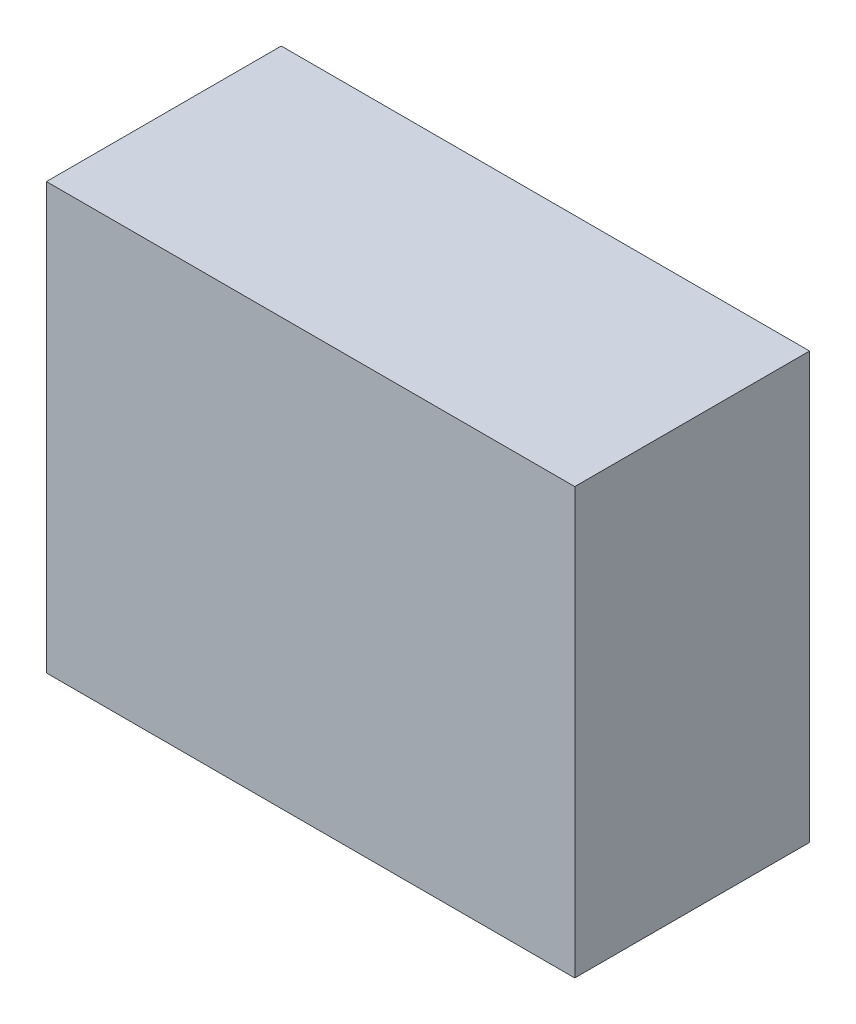
ISO-10303-21;
HEADER;
FILE_DESCRIPTION(('STEP AP214'),'2;1');
FILE_NAME('part.step','',(''),(''),'','','');
FILE_SCHEMA(('AUTOMOTIVE_DESIGN { 1 0 10303 214 1 1 1 1 }'));
ENDSEC;
DATA;
#1=APPLICATION_CONTEXT('core data for automotive mechanical design processes');
#2=APPLICATION_PROTOCOL_DEFINITION('international standard','automotive_design',2000,#1);
#3=PRODUCT_CONTEXT('',#1,'mechanical');
#4=PRODUCT('Part','Part','',(#3));
#5=PRODUCT_RELATED_PRODUCT_CATEGORY('part','',(#4));
#6=PRODUCT_DEFINITION_FORMATION('','',#4);
#7=PRODUCT_DEFINITION_CONTEXT('part definition',#1,'design');
#8=PRODUCT_DEFINITION('design','',#6,#7);
#9=PRODUCT_DEFINITION_SHAPE('','',#8);
#10=(LENGTH_UNIT() NAMED_UNIT(*) SI_UNIT(.MILLI.,.METRE.));
#11=(NAMED_UNIT(*) PLANE_ANGLE_UNIT() SI_UNIT($,.RADIAN.));
#12=(NAMED_UNIT(*) SI_UNIT($,.STERADIAN.) SOLID_ANGLE_UNIT());
#13=UNCERTAINTY_MEASURE_WITH_UNIT(LENGTH_MEASURE(1.E-05),#10,'distance_accuracy_value','');
#14=(GEOMETRIC_REPRESENTATION_CONTEXT(3) GLOBAL_UNCERTAINTY_ASSIGNED_CONTEXT((#13)) GLOBAL_UNIT_ASSIGNED_CONTEXT((#10,
#11,#12)) REPRESENTATION_CONTEXT('',''));
#15=CARTESIAN_POINT('',(0.,0.,0.));
#16=DIRECTION('',(0.,0.,1.));
#17=DIRECTION('',(1.,0.,0.));
#18=AXIS2_PLACEMENT_3D('',#15,#16,#17);
#19=CARTESIAN_POINT('',(-405.971326192233,-309.730519005755,203.2));
#20=DIRECTION('',(-1.,0.,0.));
#21=DIRECTION('',(0.,0.,1.));
#22=AXIS2_PLACEMENT_3D('',#19,#20,#21);
#23=PLANE('',#22);
#24=DIRECTION('',(0.,1.,0.));
#25=VECTOR('',#24,1.);
#26=CARTESIAN_POINT('',(-405.971326192233,-309.730519005755,0.));
#27=LINE('',#26,#25);
#28=CARTESIAN_POINT('',(-405.971326192233,-309.730519005755,0.));
#29=VERTEX_POINT('',#28);
#30=CARTESIAN_POINT('',(-405.971326192233,58.5694809942447,0.));
#31=VERTEX_POINT('',#30);
#32=EDGE_CURVE('E100',#29,#31,#27,.T.);
#33=ORIENTED_EDGE('',*,*,#32,.T.);
#34=DIRECTION('',(0.,0.,-1.));
#35=VECTOR('',#34,1.);
#36=CARTESIAN_POINT('',(-405.971326192233,58.5694809942447,203.2));
#37=LINE('',#36,#35);
#38=CARTESIAN_POINT('',(-405.971326192233,58.5694809942447,203.2));
#39=VERTEX_POINT('',#38);
#40=EDGE_CURVE('E11',#39,#31,#37,.T.);
#41=ORIENTED_EDGE('',*,*,#40,.F.);
#42=DIRECTION('',(0.,1.,0.));
#43=VECTOR('',#42,1.);
#44=CARTESIAN_POINT('',(-405.971326192233,-309.730519005755,203.2));
#45=LINE('',#44,#43);
#46=CARTESIAN_POINT('',(-405.971326192233,-309.730519005755,203.2));
#47=VERTEX_POINT('',#46);
#48=EDGE_CURVE('E88',#47,#39,#45,.T.);
#49=ORIENTED_EDGE('',*,*,#48,.F.);
#50=DIRECTION('',(0.,0.,-1.));
#51=VECTOR('',#50,1.);
#52=CARTESIAN_POINT('',(-405.971326192233,-309.730519005755,203.2));
#53=LINE('',#52,#51);
#54=EDGE_CURVE('E96',#47,#29,#53,.T.);
#55=ORIENTED_EDGE('',*,*,#54,.T.);
#56=EDGE_LOOP('',(#33,#41,#49,#55));
#57=FACE_BOUND('',#56,.T.);
#58=ADVANCED_FACE('F37',(#57),#23,.F.);
#59=CARTESIAN_POINT('',(-405.971326192233,58.5694809942447,203.2));
#60=DIRECTION('',(0.,-1.,0.));
#61=DIRECTION('',(1.,0.,0.));
#62=AXIS2_PLACEMENT_3D('',#59,#60,#61);
#63=PLANE('',#62);
#64=DIRECTION('',(-1.,0.,0.));
#65=VECTOR('',#64,1.);
#66=CARTESIAN_POINT('',(-405.971326192233,58.5694809942447,0.));
#67=LINE('',#66,#65);
#68=CARTESIAN_POINT('',(-863.171326192233,58.5694809942447,0.));
#69=VERTEX_POINT('',#68);
#70=EDGE_CURVE('E92',#31,#69,#67,.T.);
#71=ORIENTED_EDGE('',*,*,#70,.T.);
#72=DIRECTION('',(0.,0.,-1.));
#73=VECTOR('',#72,1.);
#74=CARTESIAN_POINT('',(-863.171326192233,58.5694809942447,203.2));
#75=LINE('',#74,#73);
#76=CARTESIAN_POINT('',(-863.171326192233,58.5694809942447,203.2));
#77=VERTEX_POINT('',#76);
#78=EDGE_CURVE('E45',#77,#69,#75,.T.);
#79=ORIENTED_EDGE('',*,*,#78,.F.);
#80=DIRECTION('',(-1.,0.,0.));
#81=VECTOR('',#80,1.);
#82=CARTESIAN_POINT('',(-405.971326192233,58.5694809942447,203.2));
#83=LINE('',#82,#81);
#84=EDGE_CURVE('E83',#39,#77,#83,.T.);
#85=ORIENTED_EDGE('',*,*,#84,.F.);
#86=ORIENTED_EDGE('',*,*,#40,.T.);
#87=EDGE_LOOP('',(#71,#79,#85,#86));
#88=FACE_BOUND('',#87,.T.);
#89=ADVANCED_FACE('F91',(#88),#63,.F.);
#90=CARTESIAN_POINT('',(-863.171326192233,-309.730519005755,203.2));
#91=DIRECTION('',(1.,0.,0.));
#92=DIRECTION('',(0.,0.,-1.));
#93=AXIS2_PLACEMENT_3D('',#90,#91,#92);
#94=PLANE('',#93);
#95=DIRECTION('',(0.,-1.,0.));
#96=VECTOR('',#95,1.);
#97=CARTESIAN_POINT('',(-863.171326192233,-309.730519005755,0.));
#98=LINE('',#97,#96);
#99=CARTESIAN_POINT('',(-863.171326192233,-309.730519005755,0.));
#100=VERTEX_POINT('',#99);
#101=EDGE_CURVE('E70',#69,#100,#98,.T.);
#102=ORIENTED_EDGE('',*,*,#101,.T.);
#103=DIRECTION('',(0.,0.,-1.));
#104=VECTOR('',#103,1.);
#105=CARTESIAN_POINT('',(-863.171326192233,-309.730519005755,203.2));
#106=LINE('',#105,#104);
#107=CARTESIAN_POINT('',(-863.171326192233,-309.730519005755,203.2));
#108=VERTEX_POINT('',#107);
#109=EDGE_CURVE('E93',#108,#100,#106,.T.);
#110=ORIENTED_EDGE('',*,*,#109,.F.);
#111=DIRECTION('',(0.,-1.,0.));
#112=VECTOR('',#111,1.);
#113=CARTESIAN_POINT('',(-863.171326192233,-309.730519005755,203.2));
#114=LINE('',#113,#112);
#115=EDGE_CURVE('E86',#77,#108,#114,.T.);
#116=ORIENTED_EDGE('',*,*,#115,.F.);
#117=ORIENTED_EDGE('',*,*,#78,.T.);
#118=EDGE_LOOP('',(#102,#110,#116,#117));
#119=FACE_BOUND('',#118,.T.);
#120=ADVANCED_FACE('F94',(#119),#94,.F.);
#121=CARTESIAN_POINT('',(-405.971326192233,-309.730519005755,203.2));
#122=DIRECTION('',(0.,1.,0.));
#123=DIRECTION('',(-1.,0.,0.));
#124=AXIS2_PLACEMENT_3D('',#121,#122,#123);
#125=PLANE('',#124);
#126=DIRECTION('',(1.,0.,0.));
#127=VECTOR('',#126,1.);
#128=CARTESIAN_POINT('',(-405.971326192233,-309.730519005755,0.));
#129=LINE('',#128,#127);
#130=EDGE_CURVE('E76',#100,#29,#129,.T.);
#131=ORIENTED_EDGE('',*,*,#130,.T.);
#132=ORIENTED_EDGE('',*,*,#54,.F.);
#133=DIRECTION('',(1.,0.,0.));
#134=VECTOR('',#133,1.);
#135=CARTESIAN_POINT('',(-405.971326192233,-309.730519005755,203.2));
#136=LINE('',#135,#134);
#137=EDGE_CURVE('E53',#108,#47,#136,.T.);
#138=ORIENTED_EDGE('',*,*,#137,.F.);
#139=ORIENTED_EDGE('',*,*,#109,.T.);
#140=EDGE_LOOP('',(#131,#132,#138,#139));
#141=FACE_BOUND('',#140,.T.);
#142=ADVANCED_FACE('F107',(#141),#125,.F.);
#143=CARTESIAN_POINT('',(0.,0.,203.2));
#144=DIRECTION('',(0.,0.,1.));
#145=DIRECTION('',(1.,0.,0.));
#146=AXIS2_PLACEMENT_3D('',#143,#144,#145);
#147=PLANE('',#146);
#148=ORIENTED_EDGE('',*,*,#48,.T.);
#149=ORIENTED_EDGE('',*,*,#84,.T.);
#150=ORIENTED_EDGE('',*,*,#115,.T.);
#151=ORIENTED_EDGE('',*,*,#137,.T.);
#152=EDGE_LOOP('',(#148,#149,#150,#151));
#153=FACE_BOUND('',#152,.T.);
#154=ADVANCED_FACE('F84',(#153),#147,.T.);
#155=CARTESIAN_POINT('',(0.,0.,0.));
#156=DIRECTION('',(0.,0.,1.));
#157=DIRECTION('',(1.,0.,0.));
#158=AXIS2_PLACEMENT_3D('',#155,#156,#157);
#159=PLANE('',#158);
#160=ORIENTED_EDGE('',*,*,#32,.F.);
#161=ORIENTED_EDGE('',*,*,#130,.F.);
#162=ORIENTED_EDGE('',*,*,#101,.F.);
#163=ORIENTED_EDGE('',*,*,#70,.F.);
#164=EDGE_LOOP('',(#160,#161,#162,#163));
#165=FACE_BOUND('',#164,.T.);
#166=ADVANCED_FACE('F110',(#165),#159,.F.);
#167=CLOSED_SHELL('',(#58,#89,#120,#142,#154,#166));
#168=MANIFOLD_SOLID_BREP('B2',#167);
#169=ADVANCED_BREP_SHAPE_REPRESENTATION('',(#18,#168),#14);
#170=SHAPE_DEFINITION_REPRESENTATION(#9,#169);
ENDSEC;
END-ISO-10303-21;
